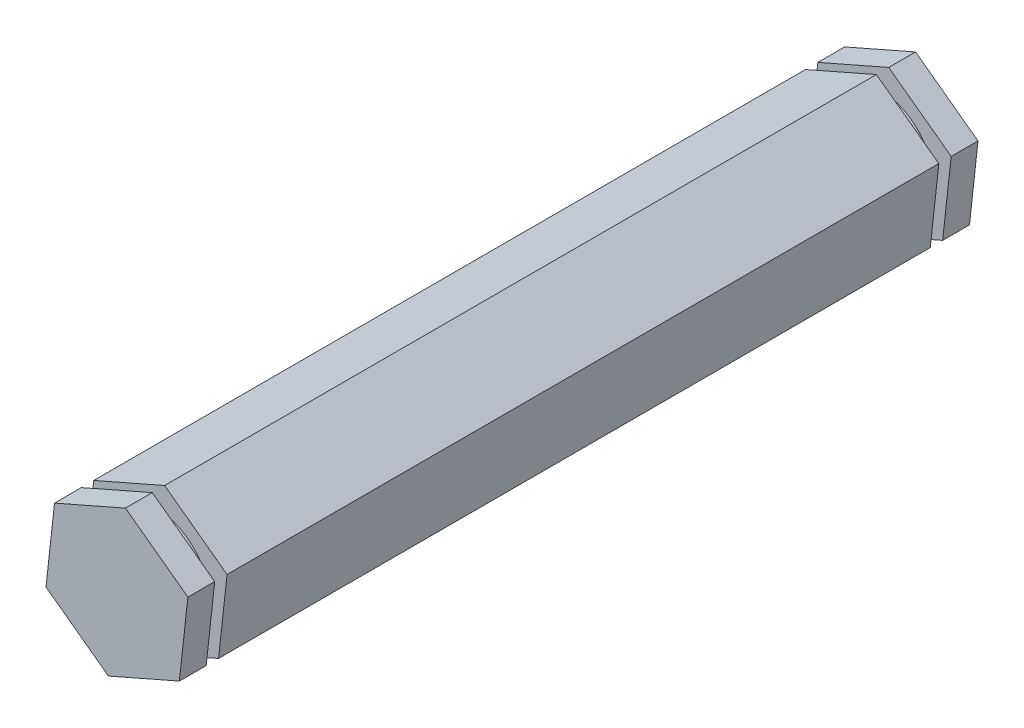
ISO-10303-21;
HEADER;
FILE_DESCRIPTION(('STEP AP214'),'2;1');
FILE_NAME('part.step','',(''),(''),'','','');
FILE_SCHEMA(('AUTOMOTIVE_DESIGN { 1 0 10303 214 1 1 1 1 }'));
ENDSEC;
DATA;
#1=APPLICATION_CONTEXT('core data for automotive mechanical design processes');
#2=APPLICATION_PROTOCOL_DEFINITION('international standard','automotive_design',2000,#1);
#3=PRODUCT_CONTEXT('',#1,'mechanical');
#4=PRODUCT('Part','Part','',(#3));
#5=PRODUCT_RELATED_PRODUCT_CATEGORY('part','',(#4));
#6=PRODUCT_DEFINITION_FORMATION('','',#4);
#7=PRODUCT_DEFINITION_CONTEXT('part definition',#1,'design');
#8=PRODUCT_DEFINITION('design','',#6,#7);
#9=PRODUCT_DEFINITION_SHAPE('','',#8);
#10=(LENGTH_UNIT() NAMED_UNIT(*) SI_UNIT(.MILLI.,.METRE.));
#11=(NAMED_UNIT(*) PLANE_ANGLE_UNIT() SI_UNIT($,.RADIAN.));
#12=(NAMED_UNIT(*) SI_UNIT($,.STERADIAN.) SOLID_ANGLE_UNIT());
#13=UNCERTAINTY_MEASURE_WITH_UNIT(LENGTH_MEASURE(1.E-05),#10,'distance_accuracy_value','');
#14=(GEOMETRIC_REPRESENTATION_CONTEXT(3) GLOBAL_UNCERTAINTY_ASSIGNED_CONTEXT((#13)) GLOBAL_UNIT_ASSIGNED_CONTEXT((#10,
#11,#12)) REPRESENTATION_CONTEXT('',''));
#15=CARTESIAN_POINT('',(0.,0.,0.));
#16=DIRECTION('',(0.,0.,1.));
#17=DIRECTION('',(1.,0.,0.));
#18=AXIS2_PLACEMENT_3D('',#15,#16,#17);
#19=CARTESIAN_POINT('',(0.,0.,0.));
#20=DIRECTION('',(0.,0.,1.));
#21=DIRECTION('',(1.,0.,0.));
#22=AXIS2_PLACEMENT_3D('',#19,#20,#21);
#23=PLANE('',#22);
#24=DIRECTION('',(0.915756500464275,0.401733782320363,0.));
#25=VECTOR('',#24,1.);
#26=CARTESIAN_POINT('',(-0.806313346316206,-7.28787980971734,0.));
#27=LINE('',#26,#25);
#28=CARTESIAN_POINT('',(-0.806313346316206,-7.28787980971734,0.));
#29=VERTEX_POINT('',#28);
#30=CARTESIAN_POINT('',(5.90833238178482,-4.34222774617895,0.));
#31=VERTEX_POINT('',#30);
#32=EDGE_CURVE('E123',#29,#31,#27,.T.);
#33=ORIENTED_EDGE('',*,*,#32,.F.);
#34=DIRECTION('',(0.805789911279979,-0.592201501922617,0.));
#35=VECTOR('',#34,1.);
#36=CARTESIAN_POINT('',(-6.71464572810102,-2.94565206353839,0.));
#37=LINE('',#36,#35);
#38=CARTESIAN_POINT('',(-6.71464572810102,-2.94565206353839,0.));
#39=VERTEX_POINT('',#38);
#40=EDGE_CURVE('E79',#39,#29,#37,.T.);
#41=ORIENTED_EDGE('',*,*,#40,.F.);
#42=DIRECTION('',(-0.109966589184295,-0.993935284242979,0.));
#43=VECTOR('',#42,1.);
#44=CARTESIAN_POINT('',(-5.90833238178481,4.34222774617895,0.));
#45=LINE('',#44,#43);
#46=CARTESIAN_POINT('',(-5.90833238178481,4.34222774617895,0.));
#47=VERTEX_POINT('',#46);
#48=EDGE_CURVE('E73',#47,#39,#45,.T.);
#49=ORIENTED_EDGE('',*,*,#48,.F.);
#50=DIRECTION('',(-0.915756500464275,-0.401733782320363,0.));
#51=VECTOR('',#50,1.);
#52=CARTESIAN_POINT('',(0.806313346316207,7.28787980971734,0.));
#53=LINE('',#52,#51);
#54=CARTESIAN_POINT('',(0.806313346316207,7.28787980971734,0.));
#55=VERTEX_POINT('',#54);
#56=EDGE_CURVE('E113',#55,#47,#53,.T.);
#57=ORIENTED_EDGE('',*,*,#56,.F.);
#58=DIRECTION('',(-0.805789911279979,0.592201501922617,0.));
#59=VECTOR('',#58,1.);
#60=CARTESIAN_POINT('',(6.71464572810102,2.94565206353839,0.));
#61=LINE('',#60,#59);
#62=CARTESIAN_POINT('',(6.71464572810102,2.94565206353839,0.));
#63=VERTEX_POINT('',#62);
#64=EDGE_CURVE('E129',#63,#55,#61,.T.);
#65=ORIENTED_EDGE('',*,*,#64,.F.);
#66=DIRECTION('',(0.109966589184295,0.993935284242979,0.));
#67=VECTOR('',#66,1.);
#68=CARTESIAN_POINT('',(5.90833238178482,-4.34222774617895,0.));
#69=LINE('',#68,#67);
#70=EDGE_CURVE('E126',#31,#63,#69,.T.);
#71=ORIENTED_EDGE('',*,*,#70,.F.);
#72=EDGE_LOOP('',(#33,#41,#49,#57,#65,#71));
#73=FACE_BOUND('',#72,.T.);
#74=CARTESIAN_POINT('',(0.,0.,0.));
#75=DIRECTION('',(0.,0.,1.));
#76=DIRECTION('',(1.,0.,0.));
#77=AXIS2_PLACEMENT_3D('',#74,#75,#76);
#78=CIRCLE('',#77,5.0292);
#79=CARTESIAN_POINT('',(5.0292,0.,0.));
#80=VERTEX_POINT('',#79);
#81=EDGE_CURVE('E11',#80,#80,#78,.F.);
#82=ORIENTED_EDGE('',*,*,#81,.F.);
#83=EDGE_LOOP('',(#82));
#84=FACE_BOUND('',#83,.T.);
#85=ADVANCED_FACE('F32',(#73,#84),#23,.F.);
#86=CARTESIAN_POINT('',(0.,0.,67.3735));
#87=DIRECTION('',(0.,0.,1.));
#88=DIRECTION('',(1.,0.,0.));
#89=AXIS2_PLACEMENT_3D('',#86,#87,#88);
#90=PLANE('',#89);
#91=DIRECTION('',(0.915756500464275,0.401733782320363,0.));
#92=VECTOR('',#91,1.);
#93=CARTESIAN_POINT('',(-0.806313346316206,-7.28787980971734,67.3735));
#94=LINE('',#93,#92);
#95=CARTESIAN_POINT('',(-0.806313346316206,-7.28787980971734,67.3735));
#96=VERTEX_POINT('',#95);
#97=CARTESIAN_POINT('',(5.90833238178482,-4.34222774617895,67.3735));
#98=VERTEX_POINT('',#97);
#99=EDGE_CURVE('E134',#96,#98,#94,.T.);
#100=ORIENTED_EDGE('',*,*,#99,.T.);
#101=DIRECTION('',(0.109966589184295,0.993935284242979,0.));
#102=VECTOR('',#101,1.);
#103=CARTESIAN_POINT('',(5.90833238178482,-4.34222774617895,67.3735));
#104=LINE('',#103,#102);
#105=CARTESIAN_POINT('',(6.71464572810102,2.94565206353839,67.3735));
#106=VERTEX_POINT('',#105);
#107=EDGE_CURVE('E88',#98,#106,#104,.T.);
#108=ORIENTED_EDGE('',*,*,#107,.T.);
#109=DIRECTION('',(-0.805789911279979,0.592201501922617,0.));
#110=VECTOR('',#109,1.);
#111=CARTESIAN_POINT('',(6.71464572810102,2.94565206353839,67.3735));
#112=LINE('',#111,#110);
#113=CARTESIAN_POINT('',(0.806313346316207,7.28787980971734,67.3735));
#114=VERTEX_POINT('',#113);
#115=EDGE_CURVE('E105',#106,#114,#112,.T.);
#116=ORIENTED_EDGE('',*,*,#115,.T.);
#117=DIRECTION('',(-0.915756500464275,-0.401733782320363,0.));
#118=VECTOR('',#117,1.);
#119=CARTESIAN_POINT('',(0.806313346316207,7.28787980971734,67.3735));
#120=LINE('',#119,#118);
#121=CARTESIAN_POINT('',(-5.90833238178481,4.34222774617895,67.3735));
#122=VERTEX_POINT('',#121);
#123=EDGE_CURVE('E98',#114,#122,#120,.T.);
#124=ORIENTED_EDGE('',*,*,#123,.T.);
#125=DIRECTION('',(-0.109966589184295,-0.993935284242979,0.));
#126=VECTOR('',#125,1.);
#127=CARTESIAN_POINT('',(-5.90833238178481,4.34222774617895,67.3735));
#128=LINE('',#127,#126);
#129=CARTESIAN_POINT('',(-6.71464572810102,-2.94565206353839,67.3735));
#130=VERTEX_POINT('',#129);
#131=EDGE_CURVE('E103',#122,#130,#128,.T.);
#132=ORIENTED_EDGE('',*,*,#131,.T.);
#133=DIRECTION('',(0.805789911279979,-0.592201501922617,0.));
#134=VECTOR('',#133,1.);
#135=CARTESIAN_POINT('',(-6.71464572810102,-2.94565206353839,67.3735));
#136=LINE('',#135,#134);
#137=EDGE_CURVE('E49',#130,#96,#136,.T.);
#138=ORIENTED_EDGE('',*,*,#137,.T.);
#139=EDGE_LOOP('',(#100,#108,#116,#124,#132,#138));
#140=FACE_BOUND('',#139,.T.);
#141=CARTESIAN_POINT('',(0.,0.,67.3735));
#142=DIRECTION('',(0.,0.,1.));
#143=DIRECTION('',(1.,0.,0.));
#144=AXIS2_PLACEMENT_3D('',#141,#142,#143);
#145=CIRCLE('',#144,5.0292);
#146=CARTESIAN_POINT('',(5.0292,0.,67.3735));
#147=VERTEX_POINT('',#146);
#148=EDGE_CURVE('E153',#147,#147,#145,.T.);
#149=ORIENTED_EDGE('',*,*,#148,.F.);
#150=EDGE_LOOP('',(#149));
#151=FACE_BOUND('',#150,.T.);
#152=ADVANCED_FACE('F100',(#140,#151),#90,.T.);
#153=CARTESIAN_POINT('',(-0.806313346316206,-7.28787980971734,67.3735));
#154=DIRECTION('',(-0.401733782320363,0.915756500464275,0.));
#155=DIRECTION('',(-0.915756500464275,-0.401733782320363,0.));
#156=AXIS2_PLACEMENT_3D('',#153,#154,#155);
#157=PLANE('',#156);
#158=ORIENTED_EDGE('',*,*,#32,.T.);
#159=DIRECTION('',(0.,0.,-1.));
#160=VECTOR('',#159,1.);
#161=CARTESIAN_POINT('',(5.90833238178482,-4.34222774617895,67.3735));
#162=LINE('',#161,#160);
#163=EDGE_CURVE('E41',#98,#31,#162,.T.);
#164=ORIENTED_EDGE('',*,*,#163,.F.);
#165=ORIENTED_EDGE('',*,*,#99,.F.);
#166=DIRECTION('',(0.,0.,-1.));
#167=VECTOR('',#166,1.);
#168=CARTESIAN_POINT('',(-0.806313346316206,-7.28787980971734,67.3735));
#169=LINE('',#168,#167);
#170=EDGE_CURVE('E119',#96,#29,#169,.T.);
#171=ORIENTED_EDGE('',*,*,#170,.T.);
#172=EDGE_LOOP('',(#158,#164,#165,#171));
#173=FACE_BOUND('',#172,.T.);
#174=ADVANCED_FACE('F34',(#173),#157,.F.);
#175=CARTESIAN_POINT('',(5.90833238178482,-4.34222774617895,67.3735));
#176=DIRECTION('',(-0.993935284242979,0.109966589184295,0.));
#177=DIRECTION('',(-0.109966589184295,-0.99393528424298,0.));
#178=AXIS2_PLACEMENT_3D('',#175,#176,#177);
#179=PLANE('',#178);
#180=ORIENTED_EDGE('',*,*,#70,.T.);
#181=DIRECTION('',(0.,0.,-1.));
#182=VECTOR('',#181,1.);
#183=CARTESIAN_POINT('',(6.71464572810102,2.94565206353839,67.3735));
#184=LINE('',#183,#182);
#185=EDGE_CURVE('E138',#106,#63,#184,.T.);
#186=ORIENTED_EDGE('',*,*,#185,.F.);
#187=ORIENTED_EDGE('',*,*,#107,.F.);
#188=ORIENTED_EDGE('',*,*,#163,.T.);
#189=EDGE_LOOP('',(#180,#186,#187,#188));
#190=FACE_BOUND('',#189,.T.);
#191=ADVANCED_FACE('F141',(#190),#179,.F.);
#192=CARTESIAN_POINT('',(6.71464572810102,2.94565206353839,67.3735));
#193=DIRECTION('',(-0.592201501922617,-0.805789911279979,0.));
#194=DIRECTION('',(0.805789911279979,-0.592201501922617,0.));
#195=AXIS2_PLACEMENT_3D('',#192,#193,#194);
#196=PLANE('',#195);
#197=ORIENTED_EDGE('',*,*,#64,.T.);
#198=DIRECTION('',(0.,0.,-1.));
#199=VECTOR('',#198,1.);
#200=CARTESIAN_POINT('',(0.806313346316207,7.28787980971734,67.3735));
#201=LINE('',#200,#199);
#202=EDGE_CURVE('E114',#114,#55,#201,.T.);
#203=ORIENTED_EDGE('',*,*,#202,.F.);
#204=ORIENTED_EDGE('',*,*,#115,.F.);
#205=ORIENTED_EDGE('',*,*,#185,.T.);
#206=EDGE_LOOP('',(#197,#203,#204,#205));
#207=FACE_BOUND('',#206,.T.);
#208=ADVANCED_FACE('F149',(#207),#196,.F.);
#209=CARTESIAN_POINT('',(0.806313346316207,7.28787980971734,67.3735));
#210=DIRECTION('',(0.401733782320363,-0.915756500464275,0.));
#211=DIRECTION('',(0.915756500464275,0.401733782320363,0.));
#212=AXIS2_PLACEMENT_3D('',#209,#210,#211);
#213=PLANE('',#212);
#214=ORIENTED_EDGE('',*,*,#56,.T.);
#215=DIRECTION('',(0.,0.,-1.));
#216=VECTOR('',#215,1.);
#217=CARTESIAN_POINT('',(-5.90833238178481,4.34222774617895,67.3735));
#218=LINE('',#217,#216);
#219=EDGE_CURVE('E110',#122,#47,#218,.T.);
#220=ORIENTED_EDGE('',*,*,#219,.F.);
#221=ORIENTED_EDGE('',*,*,#123,.F.);
#222=ORIENTED_EDGE('',*,*,#202,.T.);
#223=EDGE_LOOP('',(#214,#220,#221,#222));
#224=FACE_BOUND('',#223,.T.);
#225=ADVANCED_FACE('F111',(#224),#213,.F.);
#226=CARTESIAN_POINT('',(-5.90833238178481,4.34222774617895,67.3735));
#227=DIRECTION('',(0.993935284242979,-0.109966589184295,0.));
#228=DIRECTION('',(0.109966589184295,0.99393528424298,0.));
#229=AXIS2_PLACEMENT_3D('',#226,#227,#228);
#230=PLANE('',#229);
#231=ORIENTED_EDGE('',*,*,#48,.T.);
#232=DIRECTION('',(0.,0.,-1.));
#233=VECTOR('',#232,1.);
#234=CARTESIAN_POINT('',(-6.71464572810102,-2.94565206353839,67.3735));
#235=LINE('',#234,#233);
#236=EDGE_CURVE('E115',#130,#39,#235,.T.);
#237=ORIENTED_EDGE('',*,*,#236,.F.);
#238=ORIENTED_EDGE('',*,*,#131,.F.);
#239=ORIENTED_EDGE('',*,*,#219,.T.);
#240=EDGE_LOOP('',(#231,#237,#238,#239));
#241=FACE_BOUND('',#240,.T.);
#242=ADVANCED_FACE('F117',(#241),#230,.F.);
#243=CARTESIAN_POINT('',(-6.71464572810102,-2.94565206353839,67.3735));
#244=DIRECTION('',(0.592201501922617,0.805789911279979,0.));
#245=DIRECTION('',(-0.805789911279979,0.592201501922617,0.));
#246=AXIS2_PLACEMENT_3D('',#243,#244,#245);
#247=PLANE('',#246);
#248=ORIENTED_EDGE('',*,*,#40,.T.);
#249=ORIENTED_EDGE('',*,*,#170,.F.);
#250=ORIENTED_EDGE('',*,*,#137,.F.);
#251=ORIENTED_EDGE('',*,*,#236,.T.);
#252=EDGE_LOOP('',(#248,#249,#250,#251));
#253=FACE_BOUND('',#252,.T.);
#254=ADVANCED_FACE('F371',(#253),#247,.F.);
#255=CARTESIAN_POINT('',(0.,0.,68.5419));
#256=DIRECTION('',(0.,0.,-1.));
#257=DIRECTION('',(-1.,0.,0.));
#258=AXIS2_PLACEMENT_3D('',#255,#256,#257);
#259=CYLINDRICAL_SURFACE('',#258,5.0292);
#260=CARTESIAN_POINT('',(0.,0.,68.5419));
#261=DIRECTION('',(0.,0.,1.));
#262=DIRECTION('',(1.,0.,0.));
#263=AXIS2_PLACEMENT_3D('',#260,#261,#262);
#264=CIRCLE('',#263,5.0292);
#265=CARTESIAN_POINT('',(5.0292,0.,68.5419));
#266=VERTEX_POINT('',#265);
#267=EDGE_CURVE('E127',#266,#266,#264,.T.);
#268=ORIENTED_EDGE('',*,*,#267,.F.);
#269=EDGE_LOOP('',(#268));
#270=FACE_BOUND('',#269,.T.);
#271=ORIENTED_EDGE('',*,*,#148,.T.);
#272=EDGE_LOOP('',(#271));
#273=FACE_BOUND('',#272,.T.);
#274=ADVANCED_FACE('F374',(#270,#273),#259,.T.);
#275=CARTESIAN_POINT('',(0.,0.,68.5419));
#276=DIRECTION('',(0.,0.,1.));
#277=DIRECTION('',(1.,0.,0.));
#278=AXIS2_PLACEMENT_3D('',#275,#276,#277);
#279=PLANE('',#278);
#280=DIRECTION('',(0.805789911279979,-0.592201501922617,0.));
#281=VECTOR('',#280,1.);
#282=CARTESIAN_POINT('',(-6.71464572810102,-2.94565206353839,68.5419));
#283=LINE('',#282,#281);
#284=CARTESIAN_POINT('',(-6.71464572810102,-2.94565206353839,68.5419));
#285=VERTEX_POINT('',#284);
#286=CARTESIAN_POINT('',(-0.806313346316206,-7.28787980971734,68.5419));
#287=VERTEX_POINT('',#286);
#288=EDGE_CURVE('E193',#285,#287,#283,.T.);
#289=ORIENTED_EDGE('',*,*,#288,.F.);
#290=DIRECTION('',(-0.109966589184295,-0.993935284242979,0.));
#291=VECTOR('',#290,1.);
#292=CARTESIAN_POINT('',(-5.90833238178481,4.34222774617895,68.5419));
#293=LINE('',#292,#291);
#294=CARTESIAN_POINT('',(-5.90833238178481,4.34222774617895,68.5419));
#295=VERTEX_POINT('',#294);
#296=EDGE_CURVE('E177',#295,#285,#293,.T.);
#297=ORIENTED_EDGE('',*,*,#296,.F.);
#298=DIRECTION('',(-0.915756500464275,-0.401733782320363,0.));
#299=VECTOR('',#298,1.);
#300=CARTESIAN_POINT('',(0.806313346316207,7.28787980971734,68.5419));
#301=LINE('',#300,#299);
#302=CARTESIAN_POINT('',(0.806313346316207,7.28787980971734,68.5419));
#303=VERTEX_POINT('',#302);
#304=EDGE_CURVE('E181',#303,#295,#301,.T.);
#305=ORIENTED_EDGE('',*,*,#304,.F.);
#306=DIRECTION('',(-0.805789911279979,0.592201501922617,0.));
#307=VECTOR('',#306,1.);
#308=CARTESIAN_POINT('',(6.71464572810102,2.94565206353839,68.5419));
#309=LINE('',#308,#307);
#310=CARTESIAN_POINT('',(6.71464572810102,2.94565206353839,68.5419));
#311=VERTEX_POINT('',#310);
#312=EDGE_CURVE('E184',#311,#303,#309,.T.);
#313=ORIENTED_EDGE('',*,*,#312,.F.);
#314=DIRECTION('',(0.109966589184295,0.993935284242979,0.));
#315=VECTOR('',#314,1.);
#316=CARTESIAN_POINT('',(5.90833238178482,-4.34222774617895,68.5419));
#317=LINE('',#316,#315);
#318=CARTESIAN_POINT('',(5.90833238178482,-4.34222774617895,68.5419));
#319=VERTEX_POINT('',#318);
#320=EDGE_CURVE('E187',#319,#311,#317,.T.);
#321=ORIENTED_EDGE('',*,*,#320,.F.);
#322=DIRECTION('',(0.915756500464275,0.401733782320363,0.));
#323=VECTOR('',#322,1.);
#324=CARTESIAN_POINT('',(-0.806313346316206,-7.28787980971734,68.5419));
#325=LINE('',#324,#323);
#326=EDGE_CURVE('E190',#287,#319,#325,.T.);
#327=ORIENTED_EDGE('',*,*,#326,.F.);
#328=EDGE_LOOP('',(#289,#297,#305,#313,#321,#327));
#329=FACE_BOUND('',#328,.T.);
#330=ORIENTED_EDGE('',*,*,#267,.T.);
#331=EDGE_LOOP('',(#330));
#332=FACE_BOUND('',#331,.T.);
#333=ADVANCED_FACE('F338',(#329,#332),#279,.F.);
#334=CARTESIAN_POINT('',(-6.71464572810102,-2.94565206353839,71.0819));
#335=DIRECTION('',(0.592201501922617,0.805789911279979,0.));
#336=DIRECTION('',(-0.805789911279979,0.592201501922617,0.));
#337=AXIS2_PLACEMENT_3D('',#334,#335,#336);
#338=PLANE('',#337);
#339=ORIENTED_EDGE('',*,*,#288,.T.);
#340=DIRECTION('',(0.,0.,-1.));
#341=VECTOR('',#340,1.);
#342=CARTESIAN_POINT('',(-0.806313346316206,-7.28787980971734,71.0819));
#343=LINE('',#342,#341);
#344=CARTESIAN_POINT('',(-0.806313346316206,-7.28787980971734,71.0819));
#345=VERTEX_POINT('',#344);
#346=EDGE_CURVE('E156',#345,#287,#343,.T.);
#347=ORIENTED_EDGE('',*,*,#346,.F.);
#348=DIRECTION('',(0.805789911279979,-0.592201501922617,0.));
#349=VECTOR('',#348,1.);
#350=CARTESIAN_POINT('',(-6.71464572810102,-2.94565206353839,71.0819));
#351=LINE('',#350,#349);
#352=CARTESIAN_POINT('',(-6.71464572810102,-2.94565206353839,71.0819));
#353=VERTEX_POINT('',#352);
#354=EDGE_CURVE('E180',#353,#345,#351,.T.);
#355=ORIENTED_EDGE('',*,*,#354,.F.);
#356=DIRECTION('',(0.,0.,-1.));
#357=VECTOR('',#356,1.);
#358=CARTESIAN_POINT('',(-6.71464572810102,-2.94565206353839,71.0819));
#359=LINE('',#358,#357);
#360=EDGE_CURVE('E173',#353,#285,#359,.T.);
#361=ORIENTED_EDGE('',*,*,#360,.T.);
#362=EDGE_LOOP('',(#339,#347,#355,#361));
#363=FACE_BOUND('',#362,.T.);
#364=ADVANCED_FACE('F336',(#363),#338,.F.);
#365=CARTESIAN_POINT('',(-0.806313346316206,-7.28787980971734,71.0819));
#366=DIRECTION('',(-0.401733782320363,0.915756500464275,0.));
#367=DIRECTION('',(-0.915756500464275,-0.401733782320363,0.));
#368=AXIS2_PLACEMENT_3D('',#365,#366,#367);
#369=PLANE('',#368);
#370=ORIENTED_EDGE('',*,*,#326,.T.);
#371=DIRECTION('',(0.,0.,-1.));
#372=VECTOR('',#371,1.);
#373=CARTESIAN_POINT('',(5.90833238178482,-4.34222774617895,71.0819));
#374=LINE('',#373,#372);
#375=CARTESIAN_POINT('',(5.90833238178482,-4.34222774617895,71.0819));
#376=VERTEX_POINT('',#375);
#377=EDGE_CURVE('E161',#376,#319,#374,.T.);
#378=ORIENTED_EDGE('',*,*,#377,.F.);
#379=DIRECTION('',(0.915756500464275,0.401733782320363,0.));
#380=VECTOR('',#379,1.);
#381=CARTESIAN_POINT('',(-0.806313346316206,-7.28787980971734,71.0819));
#382=LINE('',#381,#380);
#383=EDGE_CURVE('E208',#345,#376,#382,.T.);
#384=ORIENTED_EDGE('',*,*,#383,.F.);
#385=ORIENTED_EDGE('',*,*,#346,.T.);
#386=EDGE_LOOP('',(#370,#378,#384,#385));
#387=FACE_BOUND('',#386,.T.);
#388=ADVANCED_FACE('F344',(#387),#369,.F.);
#389=CARTESIAN_POINT('',(5.90833238178482,-4.34222774617895,71.0819));
#390=DIRECTION('',(-0.99393528424298,0.109966589184295,0.));
#391=DIRECTION('',(-0.109966589184295,-0.99393528424298,0.));
#392=AXIS2_PLACEMENT_3D('',#389,#390,#391);
#393=PLANE('',#392);
#394=ORIENTED_EDGE('',*,*,#320,.T.);
#395=DIRECTION('',(0.,0.,-1.));
#396=VECTOR('',#395,1.);
#397=CARTESIAN_POINT('',(6.71464572810102,2.94565206353839,71.0819));
#398=LINE('',#397,#396);
#399=CARTESIAN_POINT('',(6.71464572810102,2.94565206353839,71.0819));
#400=VERTEX_POINT('',#399);
#401=EDGE_CURVE('E164',#400,#311,#398,.T.);
#402=ORIENTED_EDGE('',*,*,#401,.F.);
#403=DIRECTION('',(0.109966589184295,0.993935284242979,0.));
#404=VECTOR('',#403,1.);
#405=CARTESIAN_POINT('',(5.90833238178482,-4.34222774617895,71.0819));
#406=LINE('',#405,#404);
#407=EDGE_CURVE('E205',#376,#400,#406,.T.);
#408=ORIENTED_EDGE('',*,*,#407,.F.);
#409=ORIENTED_EDGE('',*,*,#377,.T.);
#410=EDGE_LOOP('',(#394,#402,#408,#409));
#411=FACE_BOUND('',#410,.T.);
#412=ADVANCED_FACE('F360',(#411),#393,.F.);
#413=CARTESIAN_POINT('',(6.71464572810102,2.94565206353839,71.0819));
#414=DIRECTION('',(-0.592201501922617,-0.805789911279979,0.));
#415=DIRECTION('',(0.805789911279979,-0.592201501922617,0.));
#416=AXIS2_PLACEMENT_3D('',#413,#414,#415);
#417=PLANE('',#416);
#418=ORIENTED_EDGE('',*,*,#312,.T.);
#419=DIRECTION('',(0.,0.,-1.));
#420=VECTOR('',#419,1.);
#421=CARTESIAN_POINT('',(0.806313346316207,7.28787980971734,71.0819));
#422=LINE('',#421,#420);
#423=CARTESIAN_POINT('',(0.806313346316207,7.28787980971734,71.0819));
#424=VERTEX_POINT('',#423);
#425=EDGE_CURVE('E167',#424,#303,#422,.T.);
#426=ORIENTED_EDGE('',*,*,#425,.F.);
#427=DIRECTION('',(-0.805789911279979,0.592201501922617,0.));
#428=VECTOR('',#427,1.);
#429=CARTESIAN_POINT('',(6.71464572810102,2.94565206353839,71.0819));
#430=LINE('',#429,#428);
#431=EDGE_CURVE('E202',#400,#424,#430,.T.);
#432=ORIENTED_EDGE('',*,*,#431,.F.);
#433=ORIENTED_EDGE('',*,*,#401,.T.);
#434=EDGE_LOOP('',(#418,#426,#432,#433));
#435=FACE_BOUND('',#434,.T.);
#436=ADVANCED_FACE('F353',(#435),#417,.F.);
#437=CARTESIAN_POINT('',(0.806313346316207,7.28787980971734,71.0819));
#438=DIRECTION('',(0.401733782320363,-0.915756500464275,0.));
#439=DIRECTION('',(0.915756500464275,0.401733782320363,0.));
#440=AXIS2_PLACEMENT_3D('',#437,#438,#439);
#441=PLANE('',#440);
#442=ORIENTED_EDGE('',*,*,#304,.T.);
#443=DIRECTION('',(0.,0.,-1.));
#444=VECTOR('',#443,1.);
#445=CARTESIAN_POINT('',(-5.90833238178481,4.34222774617895,71.0819));
#446=LINE('',#445,#444);
#447=CARTESIAN_POINT('',(-5.90833238178481,4.34222774617895,71.0819));
#448=VERTEX_POINT('',#447);
#449=EDGE_CURVE('E170',#448,#295,#446,.T.);
#450=ORIENTED_EDGE('',*,*,#449,.F.);
#451=DIRECTION('',(-0.915756500464275,-0.401733782320363,0.));
#452=VECTOR('',#451,1.);
#453=CARTESIAN_POINT('',(0.806313346316207,7.28787980971734,71.0819));
#454=LINE('',#453,#452);
#455=EDGE_CURVE('E199',#424,#448,#454,.T.);
#456=ORIENTED_EDGE('',*,*,#455,.F.);
#457=ORIENTED_EDGE('',*,*,#425,.T.);
#458=EDGE_LOOP('',(#442,#450,#456,#457));
#459=FACE_BOUND('',#458,.T.);
#460=ADVANCED_FACE('F351',(#459),#441,.F.);
#461=CARTESIAN_POINT('',(-5.90833238178481,4.34222774617895,71.0819));
#462=DIRECTION('',(0.99393528424298,-0.109966589184295,0.));
#463=DIRECTION('',(0.109966589184295,0.99393528424298,0.));
#464=AXIS2_PLACEMENT_3D('',#461,#462,#463);
#465=PLANE('',#464);
#466=ORIENTED_EDGE('',*,*,#296,.T.);
#467=ORIENTED_EDGE('',*,*,#360,.F.);
#468=DIRECTION('',(-0.109966589184295,-0.993935284242979,0.));
#469=VECTOR('',#468,1.);
#470=CARTESIAN_POINT('',(-5.90833238178481,4.34222774617895,71.0819));
#471=LINE('',#470,#469);
#472=EDGE_CURVE('E176',#448,#353,#471,.T.);
#473=ORIENTED_EDGE('',*,*,#472,.F.);
#474=ORIENTED_EDGE('',*,*,#449,.T.);
#475=EDGE_LOOP('',(#466,#467,#473,#474));
#476=FACE_BOUND('',#475,.T.);
#477=ADVANCED_FACE('F330',(#476),#465,.F.);
#478=CARTESIAN_POINT('',(0.,0.,71.0819));
#479=DIRECTION('',(0.,0.,1.));
#480=DIRECTION('',(1.,0.,0.));
#481=AXIS2_PLACEMENT_3D('',#478,#479,#480);
#482=PLANE('',#481);
#483=ORIENTED_EDGE('',*,*,#354,.T.);
#484=ORIENTED_EDGE('',*,*,#383,.T.);
#485=ORIENTED_EDGE('',*,*,#407,.T.);
#486=ORIENTED_EDGE('',*,*,#431,.T.);
#487=ORIENTED_EDGE('',*,*,#455,.T.);
#488=ORIENTED_EDGE('',*,*,#472,.T.);
#489=EDGE_LOOP('',(#483,#484,#485,#486,#487,#488));
#490=FACE_BOUND('',#489,.T.);
#491=ADVANCED_FACE('F347',(#490),#482,.T.);
#492=CARTESIAN_POINT('',(0.,0.,-1.1684));
#493=DIRECTION('',(0.,0.,1.));
#494=DIRECTION('',(1.,0.,0.));
#495=AXIS2_PLACEMENT_3D('',#492,#493,#494);
#496=CYLINDRICAL_SURFACE('',#495,5.0292);
#497=CARTESIAN_POINT('',(0.,0.,-1.1684));
#498=DIRECTION('',(0.,0.,-1.));
#499=DIRECTION('',(-1.,0.,0.));
#500=AXIS2_PLACEMENT_3D('',#497,#498,#499);
#501=CIRCLE('',#500,5.0292);
#502=CARTESIAN_POINT('',(-5.0292,0.,-1.1684));
#503=VERTEX_POINT('',#502);
#504=EDGE_CURVE('E196',#503,#503,#501,.T.);
#505=ORIENTED_EDGE('',*,*,#504,.F.);
#506=EDGE_LOOP('',(#505));
#507=FACE_BOUND('',#506,.T.);
#508=ORIENTED_EDGE('',*,*,#81,.T.);
#509=EDGE_LOOP('',(#508));
#510=FACE_BOUND('',#509,.T.);
#511=ADVANCED_FACE('F459',(#507,#510),#496,.T.);
#512=CARTESIAN_POINT('',(0.,0.,-1.1684));
#513=DIRECTION('',(0.,0.,-1.));
#514=DIRECTION('',(-1.,0.,0.));
#515=AXIS2_PLACEMENT_3D('',#512,#513,#514);
#516=PLANE('',#515);
#517=DIRECTION('',(-0.109966589184295,-0.993935284242979,0.));
#518=VECTOR('',#517,1.);
#519=CARTESIAN_POINT('',(6.71464572810102,2.94565206353839,-1.1684));
#520=LINE('',#519,#518);
#521=CARTESIAN_POINT('',(6.71464572810102,2.94565206353839,-1.1684));
#522=VERTEX_POINT('',#521);
#523=CARTESIAN_POINT('',(5.90833238178482,-4.34222774617895,-1.1684));
#524=VERTEX_POINT('',#523);
#525=EDGE_CURVE('E250',#522,#524,#520,.T.);
#526=ORIENTED_EDGE('',*,*,#525,.F.);
#527=DIRECTION('',(0.805789911279979,-0.592201501922617,0.));
#528=VECTOR('',#527,1.);
#529=CARTESIAN_POINT('',(0.806313346316207,7.28787980971734,-1.1684));
#530=LINE('',#529,#528);
#531=CARTESIAN_POINT('',(0.806313346316207,7.28787980971734,-1.1684));
#532=VERTEX_POINT('',#531);
#533=EDGE_CURVE('E234',#532,#522,#530,.T.);
#534=ORIENTED_EDGE('',*,*,#533,.F.);
#535=DIRECTION('',(0.915756500464275,0.401733782320363,0.));
#536=VECTOR('',#535,1.);
#537=CARTESIAN_POINT('',(-5.90833238178481,4.34222774617895,-1.1684));
#538=LINE('',#537,#536);
#539=CARTESIAN_POINT('',(-5.90833238178481,4.34222774617895,-1.1684));
#540=VERTEX_POINT('',#539);
#541=EDGE_CURVE('E238',#540,#532,#538,.T.);
#542=ORIENTED_EDGE('',*,*,#541,.F.);
#543=DIRECTION('',(0.109966589184295,0.993935284242979,0.));
#544=VECTOR('',#543,1.);
#545=CARTESIAN_POINT('',(-6.71464572810102,-2.94565206353839,-1.1684));
#546=LINE('',#545,#544);
#547=CARTESIAN_POINT('',(-6.71464572810102,-2.94565206353839,-1.1684));
#548=VERTEX_POINT('',#547);
#549=EDGE_CURVE('E241',#548,#540,#546,.T.);
#550=ORIENTED_EDGE('',*,*,#549,.F.);
#551=DIRECTION('',(-0.805789911279979,0.592201501922617,0.));
#552=VECTOR('',#551,1.);
#553=CARTESIAN_POINT('',(-0.806313346316206,-7.28787980971734,-1.1684));
#554=LINE('',#553,#552);
#555=CARTESIAN_POINT('',(-0.806313346316206,-7.28787980971734,-1.1684));
#556=VERTEX_POINT('',#555);
#557=EDGE_CURVE('E244',#556,#548,#554,.T.);
#558=ORIENTED_EDGE('',*,*,#557,.F.);
#559=DIRECTION('',(-0.915756500464275,-0.401733782320363,0.));
#560=VECTOR('',#559,1.);
#561=CARTESIAN_POINT('',(5.90833238178482,-4.34222774617895,-1.1684));
#562=LINE('',#561,#560);
#563=EDGE_CURVE('E247',#524,#556,#562,.T.);
#564=ORIENTED_EDGE('',*,*,#563,.F.);
#565=EDGE_LOOP('',(#526,#534,#542,#550,#558,#564));
#566=FACE_BOUND('',#565,.T.);
#567=ORIENTED_EDGE('',*,*,#504,.T.);
#568=EDGE_LOOP('',(#567));
#569=FACE_BOUND('',#568,.T.);
#570=ADVANCED_FACE('F473',(#566,#569),#516,.F.);
#571=CARTESIAN_POINT('',(6.71464572810102,2.94565206353839,-3.7084));
#572=DIRECTION('',(-0.99393528424298,0.109966589184295,0.));
#573=DIRECTION('',(-0.109966589184295,-0.99393528424298,0.));
#574=AXIS2_PLACEMENT_3D('',#571,#572,#573);
#575=PLANE('',#574);
#576=ORIENTED_EDGE('',*,*,#525,.T.);
#577=DIRECTION('',(0.,0.,1.));
#578=VECTOR('',#577,1.);
#579=CARTESIAN_POINT('',(5.90833238178482,-4.34222774617895,-3.7084));
#580=LINE('',#579,#578);
#581=CARTESIAN_POINT('',(5.90833238178482,-4.34222774617895,-3.7084));
#582=VERTEX_POINT('',#581);
#583=EDGE_CURVE('E215',#582,#524,#580,.T.);
#584=ORIENTED_EDGE('',*,*,#583,.F.);
#585=DIRECTION('',(-0.109966589184295,-0.993935284242979,0.));
#586=VECTOR('',#585,1.);
#587=CARTESIAN_POINT('',(6.71464572810102,2.94565206353839,-3.7084));
#588=LINE('',#587,#586);
#589=CARTESIAN_POINT('',(6.71464572810102,2.94565206353839,-3.7084));
#590=VERTEX_POINT('',#589);
#591=EDGE_CURVE('E237',#590,#582,#588,.T.);
#592=ORIENTED_EDGE('',*,*,#591,.F.);
#593=DIRECTION('',(0.,0.,1.));
#594=VECTOR('',#593,1.);
#595=CARTESIAN_POINT('',(6.71464572810102,2.94565206353839,-3.7084));
#596=LINE('',#595,#594);
#597=EDGE_CURVE('E230',#590,#522,#596,.T.);
#598=ORIENTED_EDGE('',*,*,#597,.T.);
#599=EDGE_LOOP('',(#576,#584,#592,#598));
#600=FACE_BOUND('',#599,.T.);
#601=ADVANCED_FACE('F282',(#600),#575,.F.);
#602=CARTESIAN_POINT('',(5.90833238178482,-4.34222774617895,-3.7084));
#603=DIRECTION('',(-0.401733782320363,0.915756500464275,0.));
#604=DIRECTION('',(-0.915756500464275,-0.401733782320363,0.));
#605=AXIS2_PLACEMENT_3D('',#602,#603,#604);
#606=PLANE('',#605);
#607=ORIENTED_EDGE('',*,*,#563,.T.);
#608=DIRECTION('',(0.,0.,1.));
#609=VECTOR('',#608,1.);
#610=CARTESIAN_POINT('',(-0.806313346316206,-7.28787980971734,-3.7084));
#611=LINE('',#610,#609);
#612=CARTESIAN_POINT('',(-0.806313346316206,-7.28787980971734,-3.7084));
#613=VERTEX_POINT('',#612);
#614=EDGE_CURVE('E218',#613,#556,#611,.T.);
#615=ORIENTED_EDGE('',*,*,#614,.F.);
#616=DIRECTION('',(-0.915756500464275,-0.401733782320363,0.));
#617=VECTOR('',#616,1.);
#618=CARTESIAN_POINT('',(5.90833238178482,-4.34222774617895,-3.7084));
#619=LINE('',#618,#617);
#620=EDGE_CURVE('E264',#582,#613,#619,.T.);
#621=ORIENTED_EDGE('',*,*,#620,.F.);
#622=ORIENTED_EDGE('',*,*,#583,.T.);
#623=EDGE_LOOP('',(#607,#615,#621,#622));
#624=FACE_BOUND('',#623,.T.);
#625=ADVANCED_FACE('F286',(#624),#606,.F.);
#626=CARTESIAN_POINT('',(-0.806313346316206,-7.28787980971734,-3.7084));
#627=DIRECTION('',(0.592201501922617,0.805789911279979,0.));
#628=DIRECTION('',(-0.805789911279979,0.592201501922617,0.));
#629=AXIS2_PLACEMENT_3D('',#626,#627,#628);
#630=PLANE('',#629);
#631=ORIENTED_EDGE('',*,*,#557,.T.);
#632=DIRECTION('',(0.,0.,1.));
#633=VECTOR('',#632,1.);
#634=CARTESIAN_POINT('',(-6.71464572810102,-2.94565206353839,-3.7084));
#635=LINE('',#634,#633);
#636=CARTESIAN_POINT('',(-6.71464572810102,-2.94565206353839,-3.7084));
#637=VERTEX_POINT('',#636);
#638=EDGE_CURVE('E221',#637,#548,#635,.T.);
#639=ORIENTED_EDGE('',*,*,#638,.F.);
#640=DIRECTION('',(-0.805789911279979,0.592201501922617,0.));
#641=VECTOR('',#640,1.);
#642=CARTESIAN_POINT('',(-0.806313346316206,-7.28787980971734,-3.7084));
#643=LINE('',#642,#641);
#644=EDGE_CURVE('E261',#613,#637,#643,.T.);
#645=ORIENTED_EDGE('',*,*,#644,.F.);
#646=ORIENTED_EDGE('',*,*,#614,.T.);
#647=EDGE_LOOP('',(#631,#639,#645,#646));
#648=FACE_BOUND('',#647,.T.);
#649=ADVANCED_FACE('F499',(#648),#630,.F.);
#650=CARTESIAN_POINT('',(-6.71464572810102,-2.94565206353839,-3.7084));
#651=DIRECTION('',(0.99393528424298,-0.109966589184295,0.));
#652=DIRECTION('',(0.109966589184295,0.99393528424298,0.));
#653=AXIS2_PLACEMENT_3D('',#650,#651,#652);
#654=PLANE('',#653);
#655=ORIENTED_EDGE('',*,*,#549,.T.);
#656=DIRECTION('',(0.,0.,1.));
#657=VECTOR('',#656,1.);
#658=CARTESIAN_POINT('',(-5.90833238178481,4.34222774617895,-3.7084));
#659=LINE('',#658,#657);
#660=CARTESIAN_POINT('',(-5.90833238178481,4.34222774617895,-3.7084));
#661=VERTEX_POINT('',#660);
#662=EDGE_CURVE('E224',#661,#540,#659,.T.);
#663=ORIENTED_EDGE('',*,*,#662,.F.);
#664=DIRECTION('',(0.109966589184295,0.993935284242979,0.));
#665=VECTOR('',#664,1.);
#666=CARTESIAN_POINT('',(-6.71464572810102,-2.94565206353839,-3.7084));
#667=LINE('',#666,#665);
#668=EDGE_CURVE('E258',#637,#661,#667,.T.);
#669=ORIENTED_EDGE('',*,*,#668,.F.);
#670=ORIENTED_EDGE('',*,*,#638,.T.);
#671=EDGE_LOOP('',(#655,#663,#669,#670));
#672=FACE_BOUND('',#671,.T.);
#673=ADVANCED_FACE('F508',(#672),#654,.F.);
#674=CARTESIAN_POINT('',(-5.90833238178481,4.34222774617895,-3.7084));
#675=DIRECTION('',(0.401733782320363,-0.915756500464275,0.));
#676=DIRECTION('',(0.915756500464275,0.401733782320363,0.));
#677=AXIS2_PLACEMENT_3D('',#674,#675,#676);
#678=PLANE('',#677);
#679=ORIENTED_EDGE('',*,*,#541,.T.);
#680=DIRECTION('',(0.,0.,1.));
#681=VECTOR('',#680,1.);
#682=CARTESIAN_POINT('',(0.806313346316207,7.28787980971734,-3.7084));
#683=LINE('',#682,#681);
#684=CARTESIAN_POINT('',(0.806313346316207,7.28787980971734,-3.7084));
#685=VERTEX_POINT('',#684);
#686=EDGE_CURVE('E227',#685,#532,#683,.T.);
#687=ORIENTED_EDGE('',*,*,#686,.F.);
#688=DIRECTION('',(0.915756500464275,0.401733782320363,0.));
#689=VECTOR('',#688,1.);
#690=CARTESIAN_POINT('',(-5.90833238178481,4.34222774617895,-3.7084));
#691=LINE('',#690,#689);
#692=EDGE_CURVE('E255',#661,#685,#691,.T.);
#693=ORIENTED_EDGE('',*,*,#692,.F.);
#694=ORIENTED_EDGE('',*,*,#662,.T.);
#695=EDGE_LOOP('',(#679,#687,#693,#694));
#696=FACE_BOUND('',#695,.T.);
#697=ADVANCED_FACE('F518',(#696),#678,.F.);
#698=CARTESIAN_POINT('',(0.806313346316207,7.28787980971734,-3.7084));
#699=DIRECTION('',(-0.592201501922617,-0.805789911279979,0.));
#700=DIRECTION('',(0.805789911279979,-0.592201501922617,0.));
#701=AXIS2_PLACEMENT_3D('',#698,#699,#700);
#702=PLANE('',#701);
#703=ORIENTED_EDGE('',*,*,#533,.T.);
#704=ORIENTED_EDGE('',*,*,#597,.F.);
#705=DIRECTION('',(0.805789911279979,-0.592201501922617,0.));
#706=VECTOR('',#705,1.);
#707=CARTESIAN_POINT('',(0.806313346316207,7.28787980971734,-3.7084));
#708=LINE('',#707,#706);
#709=EDGE_CURVE('E233',#685,#590,#708,.T.);
#710=ORIENTED_EDGE('',*,*,#709,.F.);
#711=ORIENTED_EDGE('',*,*,#686,.T.);
#712=EDGE_LOOP('',(#703,#704,#710,#711));
#713=FACE_BOUND('',#712,.T.);
#714=ADVANCED_FACE('F528',(#713),#702,.F.);
#715=CARTESIAN_POINT('',(0.,0.,-3.7084));
#716=DIRECTION('',(0.,0.,-1.));
#717=DIRECTION('',(-1.,0.,0.));
#718=AXIS2_PLACEMENT_3D('',#715,#716,#717);
#719=PLANE('',#718);
#720=ORIENTED_EDGE('',*,*,#591,.T.);
#721=ORIENTED_EDGE('',*,*,#620,.T.);
#722=ORIENTED_EDGE('',*,*,#644,.T.);
#723=ORIENTED_EDGE('',*,*,#668,.T.);
#724=ORIENTED_EDGE('',*,*,#692,.T.);
#725=ORIENTED_EDGE('',*,*,#709,.T.);
#726=EDGE_LOOP('',(#720,#721,#722,#723,#724,#725));
#727=FACE_BOUND('',#726,.T.);
#728=ADVANCED_FACE('F272',(#727),#719,.T.);
#729=CLOSED_SHELL('',(#85,#152,#174,#191,#208,#225,#242,#254,#274,#333,#364,#388,#412,#436,#460,
#477,#491,#511,#570,#601,#625,#649,#673,#697,#714,#728));
#730=MANIFOLD_SOLID_BREP('B2',#729);
#731=ADVANCED_BREP_SHAPE_REPRESENTATION('',(#18,#730),#14);
#732=SHAPE_DEFINITION_REPRESENTATION(#9,#731);
ENDSEC;
END-ISO-10303-21;
